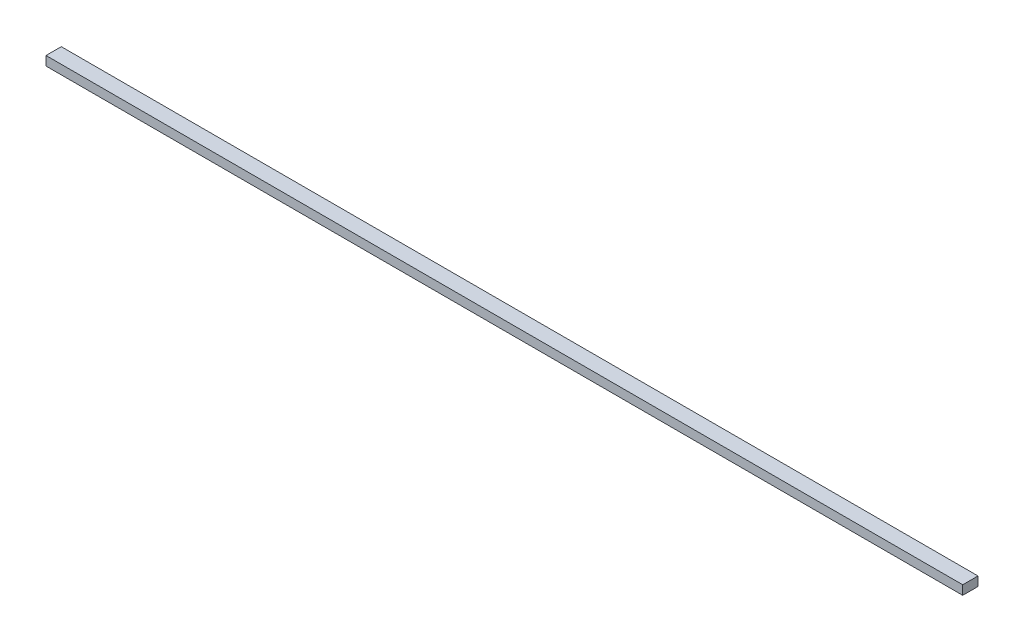
ISO-10303-21;
HEADER;
FILE_DESCRIPTION(('STEP AP214'),'2;1');
FILE_NAME('part.step','',(''),(''),'','','');
FILE_SCHEMA(('AUTOMOTIVE_DESIGN { 1 0 10303 214 1 1 1 1 }'));
ENDSEC;
DATA;
#1=APPLICATION_CONTEXT('core data for automotive mechanical design processes');
#2=APPLICATION_PROTOCOL_DEFINITION('international standard','automotive_design',2000,#1);
#3=PRODUCT_CONTEXT('',#1,'mechanical');
#4=PRODUCT('Part','Part','',(#3));
#5=PRODUCT_RELATED_PRODUCT_CATEGORY('part','',(#4));
#6=PRODUCT_DEFINITION_FORMATION('','',#4);
#7=PRODUCT_DEFINITION_CONTEXT('part definition',#1,'design');
#8=PRODUCT_DEFINITION('design','',#6,#7);
#9=PRODUCT_DEFINITION_SHAPE('','',#8);
#10=(LENGTH_UNIT() NAMED_UNIT(*) SI_UNIT(.MILLI.,.METRE.));
#11=(NAMED_UNIT(*) PLANE_ANGLE_UNIT() SI_UNIT($,.RADIAN.));
#12=(NAMED_UNIT(*) SI_UNIT($,.STERADIAN.) SOLID_ANGLE_UNIT());
#13=UNCERTAINTY_MEASURE_WITH_UNIT(LENGTH_MEASURE(1.E-05),#10,'distance_accuracy_value','');
#14=(GEOMETRIC_REPRESENTATION_CONTEXT(3) GLOBAL_UNCERTAINTY_ASSIGNED_CONTEXT((#13)) GLOBAL_UNIT_ASSIGNED_CONTEXT((#10,
#11,#12)) REPRESENTATION_CONTEXT('',''));
#15=CARTESIAN_POINT('',(0.,0.,0.));
#16=DIRECTION('',(0.,0.,1.));
#17=DIRECTION('',(1.,0.,0.));
#18=AXIS2_PLACEMENT_3D('',#15,#16,#17);
#19=CARTESIAN_POINT('',(0.,3.,0.));
#20=DIRECTION('',(1.,0.,0.));
#21=DIRECTION('',(0.,0.,-1.));
#22=AXIS2_PLACEMENT_3D('',#19,#20,#21);
#23=PLANE('',#22);
#24=DIRECTION('',(0.,0.,1.));
#25=VECTOR('',#24,1.);
#26=CARTESIAN_POINT('',(0.,0.,0.));
#27=LINE('',#26,#25);
#28=CARTESIAN_POINT('',(0.,0.,-5.));
#29=VERTEX_POINT('',#28);
#30=CARTESIAN_POINT('',(0.,0.,0.));
#31=VERTEX_POINT('',#30);
#32=EDGE_CURVE('E96',#29,#31,#27,.T.);
#33=ORIENTED_EDGE('',*,*,#32,.T.);
#34=DIRECTION('',(0.,-1.,0.));
#35=VECTOR('',#34,1.);
#36=CARTESIAN_POINT('',(0.,3.,0.));
#37=LINE('',#36,#35);
#38=CARTESIAN_POINT('',(0.,3.,0.));
#39=VERTEX_POINT('',#38);
#40=EDGE_CURVE('E11',#39,#31,#37,.T.);
#41=ORIENTED_EDGE('',*,*,#40,.F.);
#42=DIRECTION('',(0.,0.,1.));
#43=VECTOR('',#42,1.);
#44=CARTESIAN_POINT('',(0.,3.,0.));
#45=LINE('',#44,#43);
#46=CARTESIAN_POINT('',(0.,3.,-5.));
#47=VERTEX_POINT('',#46);
#48=EDGE_CURVE('E84',#47,#39,#45,.T.);
#49=ORIENTED_EDGE('',*,*,#48,.F.);
#50=DIRECTION('',(0.,-1.,0.));
#51=VECTOR('',#50,1.);
#52=CARTESIAN_POINT('',(0.,3.,-5.));
#53=LINE('',#52,#51);
#54=EDGE_CURVE('E92',#47,#29,#53,.T.);
#55=ORIENTED_EDGE('',*,*,#54,.T.);
#56=EDGE_LOOP('',(#33,#41,#49,#55));
#57=FACE_BOUND('',#56,.T.);
#58=ADVANCED_FACE('F33',(#57),#23,.F.);
#59=CARTESIAN_POINT('',(0.,3.,0.));
#60=DIRECTION('',(0.,0.,-1.));
#61=DIRECTION('',(-1.,0.,0.));
#62=AXIS2_PLACEMENT_3D('',#59,#60,#61);
#63=PLANE('',#62);
#64=DIRECTION('',(1.,0.,0.));
#65=VECTOR('',#64,1.);
#66=CARTESIAN_POINT('',(0.,0.,0.));
#67=LINE('',#66,#65);
#68=CARTESIAN_POINT('',(300.,0.,0.));
#69=VERTEX_POINT('',#68);
#70=EDGE_CURVE('E88',#31,#69,#67,.T.);
#71=ORIENTED_EDGE('',*,*,#70,.T.);
#72=DIRECTION('',(0.,-1.,0.));
#73=VECTOR('',#72,1.);
#74=CARTESIAN_POINT('',(300.,3.,0.));
#75=LINE('',#74,#73);
#76=CARTESIAN_POINT('',(300.,3.,0.));
#77=VERTEX_POINT('',#76);
#78=EDGE_CURVE('E41',#77,#69,#75,.T.);
#79=ORIENTED_EDGE('',*,*,#78,.F.);
#80=DIRECTION('',(1.,0.,0.));
#81=VECTOR('',#80,1.);
#82=CARTESIAN_POINT('',(0.,3.,0.));
#83=LINE('',#82,#81);
#84=EDGE_CURVE('E79',#39,#77,#83,.T.);
#85=ORIENTED_EDGE('',*,*,#84,.F.);
#86=ORIENTED_EDGE('',*,*,#40,.T.);
#87=EDGE_LOOP('',(#71,#79,#85,#86));
#88=FACE_BOUND('',#87,.T.);
#89=ADVANCED_FACE('F87',(#88),#63,.F.);
#90=CARTESIAN_POINT('',(300.,3.,0.));
#91=DIRECTION('',(-1.,0.,0.));
#92=DIRECTION('',(0.,0.,1.));
#93=AXIS2_PLACEMENT_3D('',#90,#91,#92);
#94=PLANE('',#93);
#95=DIRECTION('',(0.,0.,-1.));
#96=VECTOR('',#95,1.);
#97=CARTESIAN_POINT('',(300.,0.,0.));
#98=LINE('',#97,#96);
#99=CARTESIAN_POINT('',(300.,0.,-5.));
#100=VERTEX_POINT('',#99);
#101=EDGE_CURVE('E66',#69,#100,#98,.T.);
#102=ORIENTED_EDGE('',*,*,#101,.T.);
#103=DIRECTION('',(0.,-1.,0.));
#104=VECTOR('',#103,1.);
#105=CARTESIAN_POINT('',(300.,3.,-5.));
#106=LINE('',#105,#104);
#107=CARTESIAN_POINT('',(300.,3.,-5.));
#108=VERTEX_POINT('',#107);
#109=EDGE_CURVE('E89',#108,#100,#106,.T.);
#110=ORIENTED_EDGE('',*,*,#109,.F.);
#111=DIRECTION('',(0.,0.,-1.));
#112=VECTOR('',#111,1.);
#113=CARTESIAN_POINT('',(300.,3.,0.));
#114=LINE('',#113,#112);
#115=EDGE_CURVE('E82',#77,#108,#114,.T.);
#116=ORIENTED_EDGE('',*,*,#115,.F.);
#117=ORIENTED_EDGE('',*,*,#78,.T.);
#118=EDGE_LOOP('',(#102,#110,#116,#117));
#119=FACE_BOUND('',#118,.T.);
#120=ADVANCED_FACE('F90',(#119),#94,.F.);
#121=CARTESIAN_POINT('',(0.,3.,-5.));
#122=DIRECTION('',(0.,0.,1.));
#123=DIRECTION('',(1.,0.,0.));
#124=AXIS2_PLACEMENT_3D('',#121,#122,#123);
#125=PLANE('',#124);
#126=DIRECTION('',(-1.,0.,0.));
#127=VECTOR('',#126,1.);
#128=CARTESIAN_POINT('',(0.,0.,-5.));
#129=LINE('',#128,#127);
#130=EDGE_CURVE('E72',#100,#29,#129,.T.);
#131=ORIENTED_EDGE('',*,*,#130,.T.);
#132=ORIENTED_EDGE('',*,*,#54,.F.);
#133=DIRECTION('',(-1.,0.,0.));
#134=VECTOR('',#133,1.);
#135=CARTESIAN_POINT('',(0.,3.,-5.));
#136=LINE('',#135,#134);
#137=EDGE_CURVE('E49',#108,#47,#136,.T.);
#138=ORIENTED_EDGE('',*,*,#137,.F.);
#139=ORIENTED_EDGE('',*,*,#109,.T.);
#140=EDGE_LOOP('',(#131,#132,#138,#139));
#141=FACE_BOUND('',#140,.T.);
#142=ADVANCED_FACE('F103',(#141),#125,.F.);
#143=CARTESIAN_POINT('',(0.,3.,0.));
#144=DIRECTION('',(0.,-1.,0.));
#145=DIRECTION('',(0.,0.,-1.));
#146=AXIS2_PLACEMENT_3D('',#143,#144,#145);
#147=PLANE('',#146);
#148=ORIENTED_EDGE('',*,*,#48,.T.);
#149=ORIENTED_EDGE('',*,*,#84,.T.);
#150=ORIENTED_EDGE('',*,*,#115,.T.);
#151=ORIENTED_EDGE('',*,*,#137,.T.);
#152=EDGE_LOOP('',(#148,#149,#150,#151));
#153=FACE_BOUND('',#152,.T.);
#154=ADVANCED_FACE('F80',(#153),#147,.F.);
#155=CARTESIAN_POINT('',(0.,0.,0.));
#156=DIRECTION('',(0.,-1.,0.));
#157=DIRECTION('',(0.,0.,-1.));
#158=AXIS2_PLACEMENT_3D('',#155,#156,#157);
#159=PLANE('',#158);
#160=ORIENTED_EDGE('',*,*,#32,.F.);
#161=ORIENTED_EDGE('',*,*,#130,.F.);
#162=ORIENTED_EDGE('',*,*,#101,.F.);
#163=ORIENTED_EDGE('',*,*,#70,.F.);
#164=EDGE_LOOP('',(#160,#161,#162,#163));
#165=FACE_BOUND('',#164,.T.);
#166=ADVANCED_FACE('F106',(#165),#159,.T.);
#167=CLOSED_SHELL('',(#58,#89,#120,#142,#154,#166));
#168=MANIFOLD_SOLID_BREP('B2',#167);
#169=ADVANCED_BREP_SHAPE_REPRESENTATION('',(#18,#168),#14);
#170=SHAPE_DEFINITION_REPRESENTATION(#9,#169);
ENDSEC;
END-ISO-10303-21;
